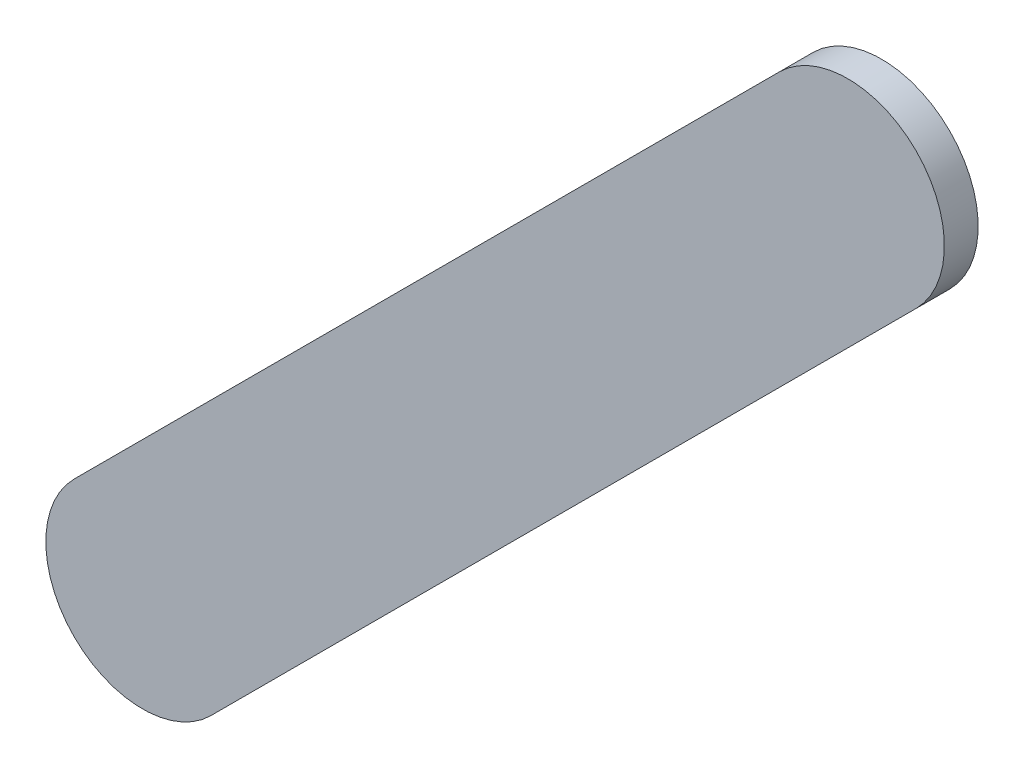
ISO-10303-21;
HEADER;
FILE_DESCRIPTION(('STEP AP214'),'2;1');
FILE_NAME('part.step','',(''),(''),'','','');
FILE_SCHEMA(('AUTOMOTIVE_DESIGN { 1 0 10303 214 1 1 1 1 }'));
ENDSEC;
DATA;
#1=APPLICATION_CONTEXT('core data for automotive mechanical design processes');
#2=APPLICATION_PROTOCOL_DEFINITION('international standard','automotive_design',2000,#1);
#3=PRODUCT_CONTEXT('',#1,'mechanical');
#4=PRODUCT('Part','Part','',(#3));
#5=PRODUCT_RELATED_PRODUCT_CATEGORY('part','',(#4));
#6=PRODUCT_DEFINITION_FORMATION('','',#4);
#7=PRODUCT_DEFINITION_CONTEXT('part definition',#1,'design');
#8=PRODUCT_DEFINITION('design','',#6,#7);
#9=PRODUCT_DEFINITION_SHAPE('','',#8);
#10=(LENGTH_UNIT() NAMED_UNIT(*) SI_UNIT(.MILLI.,.METRE.));
#11=(NAMED_UNIT(*) PLANE_ANGLE_UNIT() SI_UNIT($,.RADIAN.));
#12=(NAMED_UNIT(*) SI_UNIT($,.STERADIAN.) SOLID_ANGLE_UNIT());
#13=UNCERTAINTY_MEASURE_WITH_UNIT(LENGTH_MEASURE(1.E-05),#10,'distance_accuracy_value','');
#14=(GEOMETRIC_REPRESENTATION_CONTEXT(3) GLOBAL_UNCERTAINTY_ASSIGNED_CONTEXT((#13)) GLOBAL_UNIT_ASSIGNED_CONTEXT((#10,
#11,#12)) REPRESENTATION_CONTEXT('',''));
#15=CARTESIAN_POINT('',(0.,0.,0.));
#16=DIRECTION('',(0.,0.,1.));
#17=DIRECTION('',(1.,0.,0.));
#18=AXIS2_PLACEMENT_3D('',#15,#16,#17);
#19=CARTESIAN_POINT('',(80.909289,-111.829289,1.635));
#20=DIRECTION('',(0.,0.,1.));
#21=DIRECTION('',(1.,0.,0.));
#22=AXIS2_PLACEMENT_3D('',#19,#20,#21);
#23=PLANE('',#22);
#24=DIRECTION('',(-0.707106781186548,-0.707106781186548,0.));
#25=VECTOR('',#24,1.);
#26=CARTESIAN_POINT('',(80.909289,-111.829289,1.635));
#27=LINE('',#26,#25);
#28=CARTESIAN_POINT('',(80.909289,-111.829289,1.635));
#29=VERTEX_POINT('',#28);
#30=CARTESIAN_POINT('',(80.179289,-112.559289,1.635));
#31=VERTEX_POINT('',#30);
#32=EDGE_CURVE('E69',#29,#31,#27,.T.);
#33=ORIENTED_EDGE('',*,*,#32,.T.);
#34=CARTESIAN_POINT('',(80.2499995,-112.6299995,1.635));
#35=DIRECTION('',(0.,0.,1.));
#36=DIRECTION('',(-0.707106781187047,0.707106781186048,0.));
#37=AXIS2_PLACEMENT_3D('',#34,#35,#36);
#38=CIRCLE('',#37,0.09999974810219);
#39=CARTESIAN_POINT('',(80.32071,-112.70071,1.635));
#40=VERTEX_POINT('',#39);
#41=EDGE_CURVE('E66',#31,#40,#38,.T.);
#42=ORIENTED_EDGE('',*,*,#41,.T.);
#43=DIRECTION('',(0.707106781186548,0.707106781186548,0.));
#44=VECTOR('',#43,1.);
#45=CARTESIAN_POINT('',(80.32071,-112.70071,1.635));
#46=LINE('',#45,#44);
#47=CARTESIAN_POINT('',(81.05071,-111.97071,1.635));
#48=VERTEX_POINT('',#47);
#49=EDGE_CURVE('E53',#40,#48,#46,.T.);
#50=ORIENTED_EDGE('',*,*,#49,.T.);
#51=CARTESIAN_POINT('',(80.9799995,-111.8999995,1.635));
#52=DIRECTION('',(0.,0.,1.));
#53=DIRECTION('',(0.707106781187048,-0.707106781186048,0.));
#54=AXIS2_PLACEMENT_3D('',#51,#52,#53);
#55=CIRCLE('',#54,0.09999974810218);
#56=EDGE_CURVE('E11',#48,#29,#55,.T.);
#57=ORIENTED_EDGE('',*,*,#56,.T.);
#58=EDGE_LOOP('',(#33,#42,#50,#57));
#59=FACE_BOUND('',#58,.T.);
#60=ADVANCED_FACE('F17',(#59),#23,.T.);
#61=CARTESIAN_POINT('',(80.909289,-111.829289,1.6));
#62=DIRECTION('',(0.,0.,1.));
#63=DIRECTION('',(1.,0.,0.));
#64=AXIS2_PLACEMENT_3D('',#61,#62,#63);
#65=PLANE('',#64);
#66=CARTESIAN_POINT('',(80.9799995,-111.8999995,1.6));
#67=DIRECTION('',(0.,0.,1.));
#68=DIRECTION('',(0.707106781187048,-0.707106781186048,0.));
#69=AXIS2_PLACEMENT_3D('',#66,#67,#68);
#70=CIRCLE('',#69,0.09999974810218);
#71=CARTESIAN_POINT('',(81.05071,-111.97071,1.6));
#72=VERTEX_POINT('',#71);
#73=CARTESIAN_POINT('',(80.909289,-111.829289,1.6));
#74=VERTEX_POINT('',#73);
#75=EDGE_CURVE('E26',#72,#74,#70,.T.);
#76=ORIENTED_EDGE('',*,*,#75,.F.);
#77=DIRECTION('',(0.707106781186548,0.707106781186548,0.));
#78=VECTOR('',#77,1.);
#79=CARTESIAN_POINT('',(80.32071,-112.70071,1.6));
#80=LINE('',#79,#78);
#81=CARTESIAN_POINT('',(80.32071,-112.70071,1.6));
#82=VERTEX_POINT('',#81);
#83=EDGE_CURVE('E74',#82,#72,#80,.T.);
#84=ORIENTED_EDGE('',*,*,#83,.F.);
#85=CARTESIAN_POINT('',(80.2499995,-112.6299995,1.6));
#86=DIRECTION('',(0.,0.,1.));
#87=DIRECTION('',(-0.707106781187047,0.707106781186048,0.));
#88=AXIS2_PLACEMENT_3D('',#85,#86,#87);
#89=CIRCLE('',#88,0.09999974810219);
#90=CARTESIAN_POINT('',(80.179289,-112.559289,1.6));
#91=VERTEX_POINT('',#90);
#92=EDGE_CURVE('E78',#91,#82,#89,.T.);
#93=ORIENTED_EDGE('',*,*,#92,.F.);
#94=DIRECTION('',(-0.707106781186548,-0.707106781186548,0.));
#95=VECTOR('',#94,1.);
#96=CARTESIAN_POINT('',(80.909289,-111.829289,1.6));
#97=LINE('',#96,#95);
#98=EDGE_CURVE('E107',#74,#91,#97,.T.);
#99=ORIENTED_EDGE('',*,*,#98,.F.);
#100=EDGE_LOOP('',(#76,#84,#93,#99));
#101=FACE_BOUND('',#100,.T.);
#102=ADVANCED_FACE('F109',(#101),#65,.F.);
#103=CARTESIAN_POINT('',(80.9799995,-111.8999995,1.6));
#104=DIRECTION('',(0.,0.,-1.));
#105=DIRECTION('',(0.707106781187048,-0.707106781186048,0.));
#106=AXIS2_PLACEMENT_3D('',#103,#104,#105);
#107=CYLINDRICAL_SURFACE('',#106,0.09999974810218);
#108=ORIENTED_EDGE('',*,*,#75,.T.);
#109=DIRECTION('',(0.,0.,1.));
#110=VECTOR('',#109,1.);
#111=CARTESIAN_POINT('',(80.909289,-111.829289,1.6));
#112=LINE('',#111,#110);
#113=EDGE_CURVE('E85',#74,#29,#112,.T.);
#114=ORIENTED_EDGE('',*,*,#113,.T.);
#115=ORIENTED_EDGE('',*,*,#56,.F.);
#116=DIRECTION('',(0.,0.,1.));
#117=VECTOR('',#116,1.);
#118=CARTESIAN_POINT('',(81.05071,-111.97071,1.6));
#119=LINE('',#118,#117);
#120=EDGE_CURVE('E60',#72,#48,#119,.T.);
#121=ORIENTED_EDGE('',*,*,#120,.F.);
#122=EDGE_LOOP('',(#108,#114,#115,#121));
#123=FACE_BOUND('',#122,.T.);
#124=ADVANCED_FACE('F98',(#123),#107,.T.);
#125=CARTESIAN_POINT('',(80.32071,-112.70071,1.6));
#126=DIRECTION('',(-0.707106781186548,0.707106781186548,0.));
#127=DIRECTION('',(0.,0.,1.));
#128=AXIS2_PLACEMENT_3D('',#125,#126,#127);
#129=PLANE('',#128);
#130=ORIENTED_EDGE('',*,*,#83,.T.);
#131=ORIENTED_EDGE('',*,*,#120,.T.);
#132=ORIENTED_EDGE('',*,*,#49,.F.);
#133=DIRECTION('',(0.,0.,1.));
#134=VECTOR('',#133,1.);
#135=CARTESIAN_POINT('',(80.32071,-112.70071,1.6));
#136=LINE('',#135,#134);
#137=EDGE_CURVE('E58',#82,#40,#136,.T.);
#138=ORIENTED_EDGE('',*,*,#137,.F.);
#139=EDGE_LOOP('',(#130,#131,#132,#138));
#140=FACE_BOUND('',#139,.T.);
#141=ADVANCED_FACE('F56',(#140),#129,.F.);
#142=CARTESIAN_POINT('',(80.2499995,-112.6299995,1.6));
#143=DIRECTION('',(0.,0.,-1.));
#144=DIRECTION('',(-0.707106781187048,0.707106781186048,0.));
#145=AXIS2_PLACEMENT_3D('',#142,#143,#144);
#146=CYLINDRICAL_SURFACE('',#145,0.09999974810219);
#147=ORIENTED_EDGE('',*,*,#92,.T.);
#148=ORIENTED_EDGE('',*,*,#137,.T.);
#149=ORIENTED_EDGE('',*,*,#41,.F.);
#150=DIRECTION('',(0.,0.,1.));
#151=VECTOR('',#150,1.);
#152=CARTESIAN_POINT('',(80.179289,-112.559289,1.6));
#153=LINE('',#152,#151);
#154=EDGE_CURVE('E111',#91,#31,#153,.T.);
#155=ORIENTED_EDGE('',*,*,#154,.F.);
#156=EDGE_LOOP('',(#147,#148,#149,#155));
#157=FACE_BOUND('',#156,.T.);
#158=ADVANCED_FACE('F76',(#157),#146,.T.);
#159=CARTESIAN_POINT('',(80.909289,-111.829289,1.6));
#160=DIRECTION('',(0.707106781186548,-0.707106781186548,0.));
#161=DIRECTION('',(0.,0.,-1.));
#162=AXIS2_PLACEMENT_3D('',#159,#160,#161);
#163=PLANE('',#162);
#164=ORIENTED_EDGE('',*,*,#98,.T.);
#165=ORIENTED_EDGE('',*,*,#154,.T.);
#166=ORIENTED_EDGE('',*,*,#32,.F.);
#167=ORIENTED_EDGE('',*,*,#113,.F.);
#168=EDGE_LOOP('',(#164,#165,#166,#167));
#169=FACE_BOUND('',#168,.T.);
#170=ADVANCED_FACE('F106',(#169),#163,.F.);
#171=CLOSED_SHELL('',(#60,#102,#124,#141,#158,#170));
#172=MANIFOLD_SOLID_BREP('B1',#171);
#173=ADVANCED_BREP_SHAPE_REPRESENTATION('',(#18,#172),#14);
#174=SHAPE_DEFINITION_REPRESENTATION(#9,#173);
ENDSEC;
END-ISO-10303-21;
